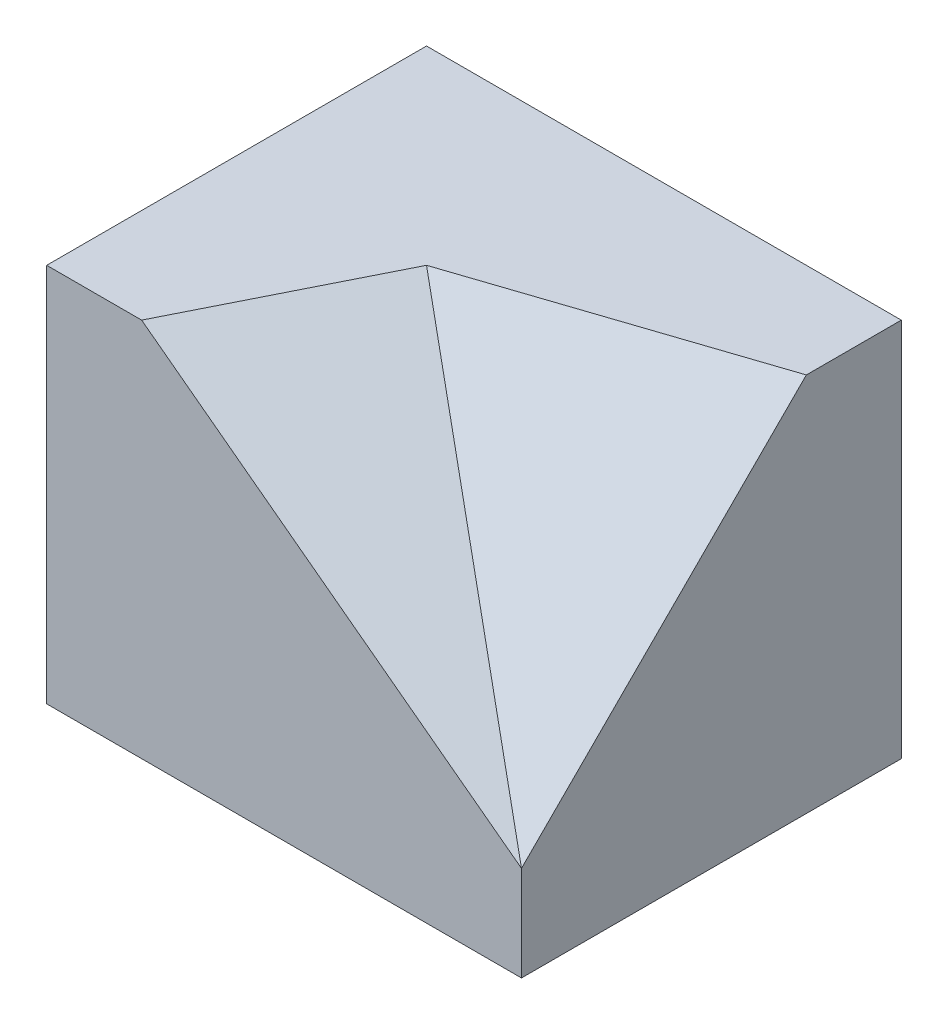
ISO-10303-21;
HEADER;
FILE_DESCRIPTION(('STEP AP214'),'2;1');
FILE_NAME('part.step','',(''),(''),'','','');
FILE_SCHEMA(('AUTOMOTIVE_DESIGN { 1 0 10303 214 1 1 1 1 }'));
ENDSEC;
DATA;
#1=APPLICATION_CONTEXT('core data for automotive mechanical design processes');
#2=APPLICATION_PROTOCOL_DEFINITION('international standard','automotive_design',2000,#1);
#3=PRODUCT_CONTEXT('',#1,'mechanical');
#4=PRODUCT('Part','Part','',(#3));
#5=PRODUCT_RELATED_PRODUCT_CATEGORY('part','',(#4));
#6=PRODUCT_DEFINITION_FORMATION('','',#4);
#7=PRODUCT_DEFINITION_CONTEXT('part definition',#1,'design');
#8=PRODUCT_DEFINITION('design','',#6,#7);
#9=PRODUCT_DEFINITION_SHAPE('','',#8);
#10=(LENGTH_UNIT() NAMED_UNIT(*) SI_UNIT(.MILLI.,.METRE.));
#11=(NAMED_UNIT(*) PLANE_ANGLE_UNIT() SI_UNIT($,.RADIAN.));
#12=(NAMED_UNIT(*) SI_UNIT($,.STERADIAN.) SOLID_ANGLE_UNIT());
#13=UNCERTAINTY_MEASURE_WITH_UNIT(LENGTH_MEASURE(1.E-05),#10,'distance_accuracy_value','');
#14=(GEOMETRIC_REPRESENTATION_CONTEXT(3) GLOBAL_UNCERTAINTY_ASSIGNED_CONTEXT((#13)) GLOBAL_UNIT_ASSIGNED_CONTEXT((#10,
#11,#12)) REPRESENTATION_CONTEXT('',''));
#15=CARTESIAN_POINT('',(0.,0.,0.));
#16=DIRECTION('',(0.,0.,1.));
#17=DIRECTION('',(1.,0.,0.));
#18=AXIS2_PLACEMENT_3D('',#15,#16,#17);
#19=CARTESIAN_POINT('',(0.,0.,40.));
#20=DIRECTION('',(0.,-1.,0.));
#21=DIRECTION('',(1.,0.,0.));
#22=AXIS2_PLACEMENT_3D('',#19,#20,#21);
#23=PLANE('',#22);
#24=DIRECTION('',(-0.447213595499958,0.,0.894427190999916));
#25=VECTOR('',#24,1.);
#26=CARTESIAN_POINT('',(-30.,0.,20.));
#27=LINE('',#26,#25);
#28=CARTESIAN_POINT('',(-30.,0.,20.));
#29=VERTEX_POINT('',#28);
#30=CARTESIAN_POINT('',(-40.,0.,40.));
#31=VERTEX_POINT('',#30);
#32=EDGE_CURVE('E59',#29,#31,#27,.T.);
#33=ORIENTED_EDGE('',*,*,#32,.F.);
#34=DIRECTION('',(-0.948683298050514,0.,0.316227766016838));
#35=VECTOR('',#34,1.);
#36=CARTESIAN_POINT('',(0.,0.,10.));
#37=LINE('',#36,#35);
#38=CARTESIAN_POINT('',(0.,0.,10.));
#39=VERTEX_POINT('',#38);
#40=EDGE_CURVE('E45',#39,#29,#37,.T.);
#41=ORIENTED_EDGE('',*,*,#40,.F.);
#42=DIRECTION('',(0.,0.,-1.));
#43=VECTOR('',#42,1.);
#44=CARTESIAN_POINT('',(0.,0.,40.));
#45=LINE('',#44,#43);
#46=CARTESIAN_POINT('',(0.,0.,0.));
#47=VERTEX_POINT('',#46);
#48=EDGE_CURVE('E12',#39,#47,#45,.T.);
#49=ORIENTED_EDGE('',*,*,#48,.T.);
#50=DIRECTION('',(-1.,0.,0.));
#51=VECTOR('',#50,1.);
#52=CARTESIAN_POINT('',(0.,0.,0.));
#53=LINE('',#52,#51);
#54=CARTESIAN_POINT('',(-50.,0.,0.));
#55=VERTEX_POINT('',#54);
#56=EDGE_CURVE('E172',#47,#55,#53,.T.);
#57=ORIENTED_EDGE('',*,*,#56,.T.);
#58=DIRECTION('',(0.,0.,-1.));
#59=VECTOR('',#58,1.);
#60=CARTESIAN_POINT('',(-50.,0.,40.));
#61=LINE('',#60,#59);
#62=CARTESIAN_POINT('',(-50.,0.,40.));
#63=VERTEX_POINT('',#62);
#64=EDGE_CURVE('E51',#63,#55,#61,.T.);
#65=ORIENTED_EDGE('',*,*,#64,.F.);
#66=DIRECTION('',(-1.,0.,0.));
#67=VECTOR('',#66,1.);
#68=CARTESIAN_POINT('',(0.,0.,40.));
#69=LINE('',#68,#67);
#70=EDGE_CURVE('E92',#31,#63,#69,.T.);
#71=ORIENTED_EDGE('',*,*,#70,.F.);
#72=EDGE_LOOP('',(#33,#41,#49,#57,#65,#71));
#73=FACE_BOUND('',#72,.T.);
#74=ADVANCED_FACE('F41',(#73),#23,.F.);
#75=CARTESIAN_POINT('',(0.,0.,40.));
#76=DIRECTION('',(0.,0.,-1.));
#77=DIRECTION('',(-1.,0.,0.));
#78=AXIS2_PLACEMENT_3D('',#75,#76,#77);
#79=PLANE('',#78);
#80=DIRECTION('',(0.8,-0.6,0.));
#81=VECTOR('',#80,1.);
#82=CARTESIAN_POINT('',(-40.,0.,40.));
#83=LINE('',#82,#81);
#84=CARTESIAN_POINT('',(0.,-30.,40.));
#85=VERTEX_POINT('',#84);
#86=EDGE_CURVE('E103',#31,#85,#83,.T.);
#87=ORIENTED_EDGE('',*,*,#86,.F.);
#88=ORIENTED_EDGE('',*,*,#70,.T.);
#89=DIRECTION('',(0.,-1.,0.));
#90=VECTOR('',#89,1.);
#91=CARTESIAN_POINT('',(-50.,0.,40.));
#92=LINE('',#91,#90);
#93=CARTESIAN_POINT('',(-50.,-40.,40.));
#94=VERTEX_POINT('',#93);
#95=EDGE_CURVE('E194',#63,#94,#92,.T.);
#96=ORIENTED_EDGE('',*,*,#95,.T.);
#97=DIRECTION('',(1.,0.,0.));
#98=VECTOR('',#97,1.);
#99=CARTESIAN_POINT('',(0.,-40.,40.));
#100=LINE('',#99,#98);
#101=CARTESIAN_POINT('',(0.,-40.,40.));
#102=VERTEX_POINT('',#101);
#103=EDGE_CURVE('E69',#94,#102,#100,.T.);
#104=ORIENTED_EDGE('',*,*,#103,.T.);
#105=DIRECTION('',(0.,1.,0.));
#106=VECTOR('',#105,1.);
#107=CARTESIAN_POINT('',(0.,0.,40.));
#108=LINE('',#107,#106);
#109=EDGE_CURVE('E183',#102,#85,#108,.T.);
#110=ORIENTED_EDGE('',*,*,#109,.T.);
#111=EDGE_LOOP('',(#87,#88,#96,#104,#110));
#112=FACE_BOUND('',#111,.T.);
#113=ADVANCED_FACE('F138',(#112),#79,.F.);
#114=CARTESIAN_POINT('',(0.,0.,40.));
#115=DIRECTION('',(-1.,0.,0.));
#116=DIRECTION('',(0.,0.,1.));
#117=AXIS2_PLACEMENT_3D('',#114,#115,#116);
#118=PLANE('',#117);
#119=DIRECTION('',(0.,0.707106781186547,-0.707106781186547));
#120=VECTOR('',#119,1.);
#121=CARTESIAN_POINT('',(0.,-30.,40.));
#122=LINE('',#121,#120);
#123=EDGE_CURVE('E107',#85,#39,#122,.T.);
#124=ORIENTED_EDGE('',*,*,#123,.F.);
#125=ORIENTED_EDGE('',*,*,#109,.F.);
#126=DIRECTION('',(0.,0.,-1.));
#127=VECTOR('',#126,1.);
#128=CARTESIAN_POINT('',(0.,-40.,40.));
#129=LINE('',#128,#127);
#130=CARTESIAN_POINT('',(0.,-40.,0.));
#131=VERTEX_POINT('',#130);
#132=EDGE_CURVE('E184',#102,#131,#129,.T.);
#133=ORIENTED_EDGE('',*,*,#132,.T.);
#134=DIRECTION('',(0.,1.,0.));
#135=VECTOR('',#134,1.);
#136=CARTESIAN_POINT('',(0.,0.,0.));
#137=LINE('',#136,#135);
#138=EDGE_CURVE('E170',#131,#47,#137,.T.);
#139=ORIENTED_EDGE('',*,*,#138,.T.);
#140=ORIENTED_EDGE('',*,*,#48,.F.);
#141=EDGE_LOOP('',(#124,#125,#133,#139,#140));
#142=FACE_BOUND('',#141,.T.);
#143=ADVANCED_FACE('F43',(#142),#118,.F.);
#144=CARTESIAN_POINT('',(-50.,0.,40.));
#145=DIRECTION('',(1.,0.,0.));
#146=DIRECTION('',(0.,1.,0.));
#147=AXIS2_PLACEMENT_3D('',#144,#145,#146);
#148=PLANE('',#147);
#149=DIRECTION('',(0.,-1.,0.));
#150=VECTOR('',#149,1.);
#151=CARTESIAN_POINT('',(-50.,0.,0.));
#152=LINE('',#151,#150);
#153=CARTESIAN_POINT('',(-50.,-40.,0.));
#154=VERTEX_POINT('',#153);
#155=EDGE_CURVE('E176',#55,#154,#152,.T.);
#156=ORIENTED_EDGE('',*,*,#155,.T.);
#157=DIRECTION('',(0.,0.,-1.));
#158=VECTOR('',#157,1.);
#159=CARTESIAN_POINT('',(-50.,-40.,40.));
#160=LINE('',#159,#158);
#161=EDGE_CURVE('E186',#94,#154,#160,.T.);
#162=ORIENTED_EDGE('',*,*,#161,.F.);
#163=ORIENTED_EDGE('',*,*,#95,.F.);
#164=ORIENTED_EDGE('',*,*,#64,.T.);
#165=EDGE_LOOP('',(#156,#162,#163,#164));
#166=FACE_BOUND('',#165,.T.);
#167=ADVANCED_FACE('F147',(#166),#148,.F.);
#168=CARTESIAN_POINT('',(0.,-40.,40.));
#169=DIRECTION('',(0.,1.,0.));
#170=DIRECTION('',(0.,0.,1.));
#171=AXIS2_PLACEMENT_3D('',#168,#169,#170);
#172=PLANE('',#171);
#173=DIRECTION('',(1.,0.,0.));
#174=VECTOR('',#173,1.);
#175=CARTESIAN_POINT('',(0.,-40.,0.));
#176=LINE('',#175,#174);
#177=EDGE_CURVE('E88',#154,#131,#176,.T.);
#178=ORIENTED_EDGE('',*,*,#177,.T.);
#179=ORIENTED_EDGE('',*,*,#132,.F.);
#180=ORIENTED_EDGE('',*,*,#103,.F.);
#181=ORIENTED_EDGE('',*,*,#161,.T.);
#182=EDGE_LOOP('',(#178,#179,#180,#181));
#183=FACE_BOUND('',#182,.T.);
#184=ADVANCED_FACE('F143',(#183),#172,.F.);
#185=CARTESIAN_POINT('',(0.,0.,0.));
#186=DIRECTION('',(0.,0.,-1.));
#187=DIRECTION('',(-1.,0.,0.));
#188=AXIS2_PLACEMENT_3D('',#185,#186,#187);
#189=PLANE('',#188);
#190=ORIENTED_EDGE('',*,*,#138,.F.);
#191=ORIENTED_EDGE('',*,*,#177,.F.);
#192=ORIENTED_EDGE('',*,*,#155,.F.);
#193=ORIENTED_EDGE('',*,*,#56,.F.);
#194=EDGE_LOOP('',(#190,#191,#192,#193));
#195=FACE_BOUND('',#194,.T.);
#196=ADVANCED_FACE('F136',(#195),#189,.T.);
#197=CARTESIAN_POINT('',(1.57894736842105,4.73684210526316,4.73684210526316));
#198=DIRECTION('',(0.229415733870562,0.688247201611685,0.688247201611685));
#199=DIRECTION('',(0.,-0.707106781186548,0.707106781186547));
#200=AXIS2_PLACEMENT_3D('',#197,#198,#199);
#201=PLANE('',#200);
#202=DIRECTION('',(-0.639602149066831,0.639602149066831,-0.426401432711221));
#203=VECTOR('',#202,1.);
#204=CARTESIAN_POINT('',(0.,-30.,40.));
#205=LINE('',#204,#203);
#206=EDGE_CURVE('E101',#85,#29,#205,.T.);
#207=ORIENTED_EDGE('',*,*,#206,.F.);
#208=ORIENTED_EDGE('',*,*,#123,.T.);
#209=ORIENTED_EDGE('',*,*,#40,.T.);
#210=EDGE_LOOP('',(#207,#208,#209));
#211=FACE_BOUND('',#210,.T.);
#212=ADVANCED_FACE('F117',(#211),#201,.T.);
#213=CARTESIAN_POINT('',(-6.60550458715596,-8.80733944954128,-3.30275229357798));
#214=DIRECTION('',(-0.574695771132691,-0.766261028176921,-0.287347885566345));
#215=DIRECTION('',(0.8,-0.6,0.));
#216=AXIS2_PLACEMENT_3D('',#213,#214,#215);
#217=PLANE('',#216);
#218=ORIENTED_EDGE('',*,*,#206,.T.);
#219=ORIENTED_EDGE('',*,*,#32,.T.);
#220=ORIENTED_EDGE('',*,*,#86,.T.);
#221=EDGE_LOOP('',(#218,#219,#220));
#222=FACE_BOUND('',#221,.T.);
#223=ADVANCED_FACE('F102',(#222),#217,.F.);
#224=CLOSED_SHELL('',(#74,#113,#143,#167,#184,#196,#212,#223));
#225=MANIFOLD_SOLID_BREP('B2',#224);
#226=ADVANCED_BREP_SHAPE_REPRESENTATION('',(#18,#225),#14);
#227=SHAPE_DEFINITION_REPRESENTATION(#9,#226);
ENDSEC;
END-ISO-10303-21;
